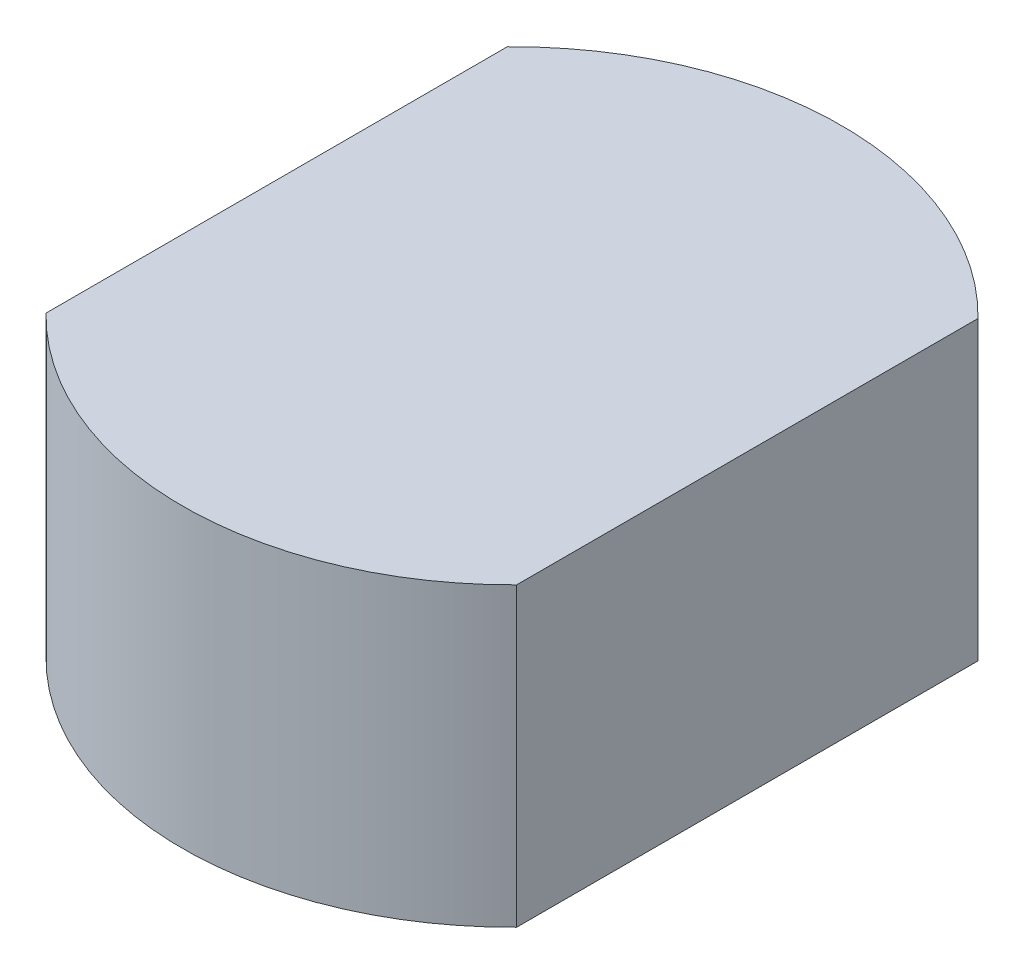
ISO-10303-21;
HEADER;
FILE_DESCRIPTION(('STEP AP214'),'2;1');
FILE_NAME('part.step','',(''),(''),'','','');
FILE_SCHEMA(('AUTOMOTIVE_DESIGN { 1 0 10303 214 1 1 1 1 }'));
ENDSEC;
DATA;
#1=APPLICATION_CONTEXT('core data for automotive mechanical design processes');
#2=APPLICATION_PROTOCOL_DEFINITION('international standard','automotive_design',2000,#1);
#3=PRODUCT_CONTEXT('',#1,'mechanical');
#4=PRODUCT('Part','Part','',(#3));
#5=PRODUCT_RELATED_PRODUCT_CATEGORY('part','',(#4));
#6=PRODUCT_DEFINITION_FORMATION('','',#4);
#7=PRODUCT_DEFINITION_CONTEXT('part definition',#1,'design');
#8=PRODUCT_DEFINITION('design','',#6,#7);
#9=PRODUCT_DEFINITION_SHAPE('','',#8);
#10=(LENGTH_UNIT() NAMED_UNIT(*) SI_UNIT(.MILLI.,.METRE.));
#11=(NAMED_UNIT(*) PLANE_ANGLE_UNIT() SI_UNIT($,.RADIAN.));
#12=(NAMED_UNIT(*) SI_UNIT($,.STERADIAN.) SOLID_ANGLE_UNIT());
#13=UNCERTAINTY_MEASURE_WITH_UNIT(LENGTH_MEASURE(1.E-05),#10,'distance_accuracy_value','');
#14=(GEOMETRIC_REPRESENTATION_CONTEXT(3) GLOBAL_UNCERTAINTY_ASSIGNED_CONTEXT((#13)) GLOBAL_UNIT_ASSIGNED_CONTEXT((#10,
#11,#12)) REPRESENTATION_CONTEXT('',''));
#15=CARTESIAN_POINT('',(0.,0.,0.));
#16=DIRECTION('',(0.,0.,1.));
#17=DIRECTION('',(1.,0.,0.));
#18=AXIS2_PLACEMENT_3D('',#15,#16,#17);
#19=CARTESIAN_POINT('',(0.,9.,0.));
#20=DIRECTION('',(0.,-1.,0.));
#21=DIRECTION('',(0.,0.,-1.));
#22=AXIS2_PLACEMENT_3D('',#19,#20,#21);
#23=CYLINDRICAL_SURFACE('',#22,10.);
#24=CARTESIAN_POINT('',(0.,0.,0.));
#25=DIRECTION('',(0.,1.,0.));
#26=DIRECTION('',(0.,0.,1.));
#27=AXIS2_PLACEMENT_3D('',#24,#25,#26);
#28=CIRCLE('',#27,10.);
#29=CARTESIAN_POINT('',(-7.14142842854285,0.,7.));
#30=VERTEX_POINT('',#29);
#31=CARTESIAN_POINT('',(7.14142842854285,0.,7.));
#32=VERTEX_POINT('',#31);
#33=EDGE_CURVE('E109',#30,#32,#28,.T.);
#34=ORIENTED_EDGE('',*,*,#33,.T.);
#35=DIRECTION('',(0.,-1.,0.));
#36=VECTOR('',#35,1.);
#37=CARTESIAN_POINT('',(7.14142842854285,9.,7.));
#38=LINE('',#37,#36);
#39=CARTESIAN_POINT('',(7.14142842854285,9.,7.));
#40=VERTEX_POINT('',#39);
#41=EDGE_CURVE('E11',#40,#32,#38,.T.);
#42=ORIENTED_EDGE('',*,*,#41,.F.);
#43=CARTESIAN_POINT('',(0.,9.,0.));
#44=DIRECTION('',(0.,1.,0.));
#45=DIRECTION('',(0.,0.,1.));
#46=AXIS2_PLACEMENT_3D('',#43,#44,#45);
#47=CIRCLE('',#46,10.);
#48=CARTESIAN_POINT('',(-7.14142842854285,9.,7.));
#49=VERTEX_POINT('',#48);
#50=EDGE_CURVE('E81',#49,#40,#47,.T.);
#51=ORIENTED_EDGE('',*,*,#50,.F.);
#52=DIRECTION('',(0.,-1.,0.));
#53=VECTOR('',#52,1.);
#54=CARTESIAN_POINT('',(-7.14142842854285,9.,7.));
#55=LINE('',#54,#53);
#56=EDGE_CURVE('E56',#49,#30,#55,.T.);
#57=ORIENTED_EDGE('',*,*,#56,.T.);
#58=EDGE_LOOP('',(#34,#42,#51,#57));
#59=FACE_BOUND('',#58,.T.);
#60=ADVANCED_FACE('F39',(#59),#23,.T.);
#61=CARTESIAN_POINT('',(7.14142842854285,9.,-7.));
#62=DIRECTION('',(1.,0.,0.));
#63=DIRECTION('',(0.,0.,-1.));
#64=AXIS2_PLACEMENT_3D('',#61,#62,#63);
#65=PLANE('',#64);
#66=DIRECTION('',(0.,0.,1.));
#67=VECTOR('',#66,1.);
#68=CARTESIAN_POINT('',(7.14142842854285,0.,-7.));
#69=LINE('',#68,#67);
#70=CARTESIAN_POINT('',(7.14142842854285,0.,-7.));
#71=VERTEX_POINT('',#70);
#72=EDGE_CURVE('E91',#71,#32,#69,.T.);
#73=ORIENTED_EDGE('',*,*,#72,.F.);
#74=DIRECTION('',(0.,-1.,0.));
#75=VECTOR('',#74,1.);
#76=CARTESIAN_POINT('',(7.14142842854285,9.,-7.));
#77=LINE('',#76,#75);
#78=CARTESIAN_POINT('',(7.14142842854285,9.,-7.));
#79=VERTEX_POINT('',#78);
#80=EDGE_CURVE('E48',#79,#71,#77,.T.);
#81=ORIENTED_EDGE('',*,*,#80,.F.);
#82=DIRECTION('',(0.,0.,1.));
#83=VECTOR('',#82,1.);
#84=CARTESIAN_POINT('',(7.14142842854285,9.,-7.));
#85=LINE('',#84,#83);
#86=EDGE_CURVE('E89',#79,#40,#85,.T.);
#87=ORIENTED_EDGE('',*,*,#86,.T.);
#88=ORIENTED_EDGE('',*,*,#41,.T.);
#89=EDGE_LOOP('',(#73,#81,#87,#88));
#90=FACE_BOUND('',#89,.T.);
#91=ADVANCED_FACE('F88',(#90),#65,.T.);
#92=CARTESIAN_POINT('',(0.,9.,0.));
#93=DIRECTION('',(0.,-1.,0.));
#94=DIRECTION('',(0.,0.,-1.));
#95=AXIS2_PLACEMENT_3D('',#92,#93,#94);
#96=CYLINDRICAL_SURFACE('',#95,10.);
#97=CARTESIAN_POINT('',(0.,0.,0.));
#98=DIRECTION('',(0.,1.,0.));
#99=DIRECTION('',(0.,0.,1.));
#100=AXIS2_PLACEMENT_3D('',#97,#98,#99);
#101=CIRCLE('',#100,10.);
#102=CARTESIAN_POINT('',(-7.14142842854285,0.,-7.));
#103=VERTEX_POINT('',#102);
#104=EDGE_CURVE('E114',#71,#103,#101,.T.);
#105=ORIENTED_EDGE('',*,*,#104,.T.);
#106=DIRECTION('',(0.,-1.,0.));
#107=VECTOR('',#106,1.);
#108=CARTESIAN_POINT('',(-7.14142842854285,9.,-7.));
#109=LINE('',#108,#107);
#110=CARTESIAN_POINT('',(-7.14142842854285,9.,-7.));
#111=VERTEX_POINT('',#110);
#112=EDGE_CURVE('E70',#111,#103,#109,.T.);
#113=ORIENTED_EDGE('',*,*,#112,.F.);
#114=CARTESIAN_POINT('',(0.,9.,0.));
#115=DIRECTION('',(0.,1.,0.));
#116=DIRECTION('',(0.,0.,1.));
#117=AXIS2_PLACEMENT_3D('',#114,#115,#116);
#118=CIRCLE('',#117,10.);
#119=EDGE_CURVE('E95',#79,#111,#118,.T.);
#120=ORIENTED_EDGE('',*,*,#119,.F.);
#121=ORIENTED_EDGE('',*,*,#80,.T.);
#122=EDGE_LOOP('',(#105,#113,#120,#121));
#123=FACE_BOUND('',#122,.T.);
#124=ADVANCED_FACE('F96',(#123),#96,.T.);
#125=CARTESIAN_POINT('',(-7.14142842854285,9.,7.));
#126=DIRECTION('',(-1.,0.,0.));
#127=DIRECTION('',(0.,0.,1.));
#128=AXIS2_PLACEMENT_3D('',#125,#126,#127);
#129=PLANE('',#128);
#130=DIRECTION('',(0.,0.,-1.));
#131=VECTOR('',#130,1.);
#132=CARTESIAN_POINT('',(-7.14142842854285,0.,7.));
#133=LINE('',#132,#131);
#134=EDGE_CURVE('E104',#30,#103,#133,.T.);
#135=ORIENTED_EDGE('',*,*,#134,.F.);
#136=ORIENTED_EDGE('',*,*,#56,.F.);
#137=DIRECTION('',(0.,0.,-1.));
#138=VECTOR('',#137,1.);
#139=CARTESIAN_POINT('',(-7.14142842854285,9.,7.));
#140=LINE('',#139,#138);
#141=EDGE_CURVE('E98',#49,#111,#140,.T.);
#142=ORIENTED_EDGE('',*,*,#141,.T.);
#143=ORIENTED_EDGE('',*,*,#112,.T.);
#144=EDGE_LOOP('',(#135,#136,#142,#143));
#145=FACE_BOUND('',#144,.T.);
#146=ADVANCED_FACE('F125',(#145),#129,.T.);
#147=CARTESIAN_POINT('',(0.,9.,0.));
#148=DIRECTION('',(0.,1.,0.));
#149=DIRECTION('',(0.,0.,1.));
#150=AXIS2_PLACEMENT_3D('',#147,#148,#149);
#151=PLANE('',#150);
#152=ORIENTED_EDGE('',*,*,#50,.T.);
#153=ORIENTED_EDGE('',*,*,#86,.F.);
#154=ORIENTED_EDGE('',*,*,#119,.T.);
#155=ORIENTED_EDGE('',*,*,#141,.F.);
#156=EDGE_LOOP('',(#152,#153,#154,#155));
#157=FACE_BOUND('',#156,.T.);
#158=ADVANCED_FACE('F100',(#157),#151,.T.);
#159=CARTESIAN_POINT('',(0.,0.,0.));
#160=DIRECTION('',(0.,1.,0.));
#161=DIRECTION('',(0.,0.,1.));
#162=AXIS2_PLACEMENT_3D('',#159,#160,#161);
#163=PLANE('',#162);
#164=ORIENTED_EDGE('',*,*,#33,.F.);
#165=ORIENTED_EDGE('',*,*,#134,.T.);
#166=ORIENTED_EDGE('',*,*,#104,.F.);
#167=ORIENTED_EDGE('',*,*,#72,.T.);
#168=EDGE_LOOP('',(#164,#165,#166,#167));
#169=FACE_BOUND('',#168,.T.);
#170=ADVANCED_FACE('F124',(#169),#163,.F.);
#171=CLOSED_SHELL('',(#60,#91,#124,#146,#158,#170));
#172=MANIFOLD_SOLID_BREP('B2',#171);
#173=ADVANCED_BREP_SHAPE_REPRESENTATION('',(#18,#172),#14);
#174=SHAPE_DEFINITION_REPRESENTATION(#9,#173);
ENDSEC;
END-ISO-10303-21;
